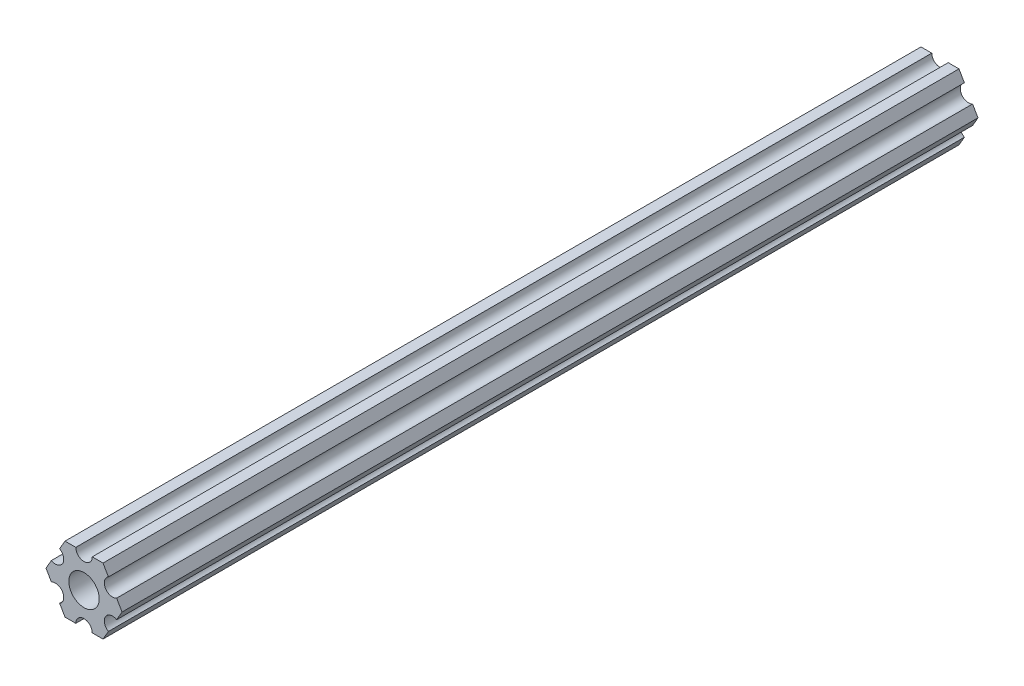
ISO-10303-21;
HEADER;
FILE_DESCRIPTION(('STEP AP214'),'2;1');
FILE_NAME('part.step','',(''),(''),'','','');
FILE_SCHEMA(('AUTOMOTIVE_DESIGN { 1 0 10303 214 1 1 1 1 }'));
ENDSEC;
DATA;
#1=APPLICATION_CONTEXT('core data for automotive mechanical design processes');
#2=APPLICATION_PROTOCOL_DEFINITION('international standard','automotive_design',2000,#1);
#3=PRODUCT_CONTEXT('',#1,'mechanical');
#4=PRODUCT('Part','Part','',(#3));
#5=PRODUCT_RELATED_PRODUCT_CATEGORY('part','',(#4));
#6=PRODUCT_DEFINITION_FORMATION('','',#4);
#7=PRODUCT_DEFINITION_CONTEXT('part definition',#1,'design');
#8=PRODUCT_DEFINITION('design','',#6,#7);
#9=PRODUCT_DEFINITION_SHAPE('','',#8);
#10=(LENGTH_UNIT() NAMED_UNIT(*) SI_UNIT(.MILLI.,.METRE.));
#11=(NAMED_UNIT(*) PLANE_ANGLE_UNIT() SI_UNIT($,.RADIAN.));
#12=(NAMED_UNIT(*) SI_UNIT($,.STERADIAN.) SOLID_ANGLE_UNIT());
#13=UNCERTAINTY_MEASURE_WITH_UNIT(LENGTH_MEASURE(1.E-05),#10,'distance_accuracy_value','');
#14=(GEOMETRIC_REPRESENTATION_CONTEXT(3) GLOBAL_UNCERTAINTY_ASSIGNED_CONTEXT((#13)) GLOBAL_UNIT_ASSIGNED_CONTEXT((#10,
#11,#12)) REPRESENTATION_CONTEXT('',''));
#15=CARTESIAN_POINT('',(0.,0.,0.));
#16=DIRECTION('',(0.,0.,1.));
#17=DIRECTION('',(1.,0.,0.));
#18=AXIS2_PLACEMENT_3D('',#15,#16,#17);
#19=CARTESIAN_POINT('',(5.49926150638083,-3.17499966684068,-165.1));
#20=DIRECTION('',(0.,0.,1.));
#21=DIRECTION('',(1.,0.,0.));
#22=AXIS2_PLACEMENT_3D('',#19,#20,#21);
#23=PLANE('',#22);
#24=CARTESIAN_POINT('',(5.49926150638083,-3.17499966684068,-165.1));
#25=DIRECTION('',(0.,0.,1.));
#26=DIRECTION('',(1.,0.,0.));
#27=AXIS2_PLACEMENT_3D('',#24,#25,#26);
#28=CIRCLE('',#27,1.58750000000001);
#29=CARTESIAN_POINT('',(6.29301142309098,-1.80018429024546,-165.1));
#30=VERTEX_POINT('',#29);
#31=CARTESIAN_POINT('',(4.70551158967068,-4.54981504343589,-165.1));
#32=VERTEX_POINT('',#31);
#33=EDGE_CURVE('E254',#30,#32,#28,.T.);
#34=ORIENTED_EDGE('',*,*,#33,.T.);
#35=DIRECTION('',(-0.499999947533953,-0.866025434075723,0.));
#36=VECTOR('',#35,1.);
#37=CARTESIAN_POINT('',(4.70551158967068,-4.54981504343589,-165.1));
#38=LINE('',#37,#36);
#39=CARTESIAN_POINT('',(3.66617452134693,-6.34999990382519,-165.1));
#40=VERTEX_POINT('',#39);
#41=EDGE_CURVE('E130',#32,#40,#38,.T.);
#42=ORIENTED_EDGE('',*,*,#41,.T.);
#43=DIRECTION('',(-1.,0.,0.));
#44=VECTOR('',#43,1.);
#45=CARTESIAN_POINT('',(3.66617452134693,-6.34999990382519,-165.1));
#46=LINE('',#45,#44);
#47=CARTESIAN_POINT('',(1.58750038469926,-6.34999990382518,-165.1));
#48=VERTEX_POINT('',#47);
#49=EDGE_CURVE('E315',#40,#48,#46,.T.);
#50=ORIENTED_EDGE('',*,*,#49,.T.);
#51=CARTESIAN_POINT('',(3.8469926204343E-07,-6.34999990382519,-165.1));
#52=DIRECTION('',(0.,0.,1.));
#53=DIRECTION('',(1.,0.,0.));
#54=AXIS2_PLACEMENT_3D('',#51,#52,#53);
#55=CIRCLE('',#54,1.5875);
#56=CARTESIAN_POINT('',(-1.58749961530074,-6.34999990382519,-165.1));
#57=VERTEX_POINT('',#56);
#58=EDGE_CURVE('E335',#48,#57,#55,.T.);
#59=ORIENTED_EDGE('',*,*,#58,.T.);
#60=DIRECTION('',(-1.,0.,0.));
#61=VECTOR('',#60,1.);
#62=CARTESIAN_POINT('',(-1.58749961530074,-6.34999990382519,-165.1));
#63=LINE('',#62,#61);
#64=CARTESIAN_POINT('',(-3.66617382465481,-6.34999990382519,-165.1));
#65=VERTEX_POINT('',#64);
#66=EDGE_CURVE('E331',#57,#65,#63,.T.);
#67=ORIENTED_EDGE('',*,*,#66,.T.);
#68=DIRECTION('',(-0.500000006198653,0.866025400205644,0.));
#69=VECTOR('',#68,1.);
#70=CARTESIAN_POINT('',(-3.66617382465481,-6.34999990382519,-165.1));
#71=LINE('',#70,#69);
#72=CARTESIAN_POINT('',(-4.70551094221689,-4.54981523977206,-165.1));
#73=VERTEX_POINT('',#72);
#74=EDGE_CURVE('E334',#65,#73,#71,.T.);
#75=ORIENTED_EDGE('',*,*,#74,.T.);
#76=CARTESIAN_POINT('',(-5.49926095205725,-3.1749999169456,-165.1));
#77=DIRECTION('',(0.,0.,1.));
#78=DIRECTION('',(1.,0.,0.));
#79=AXIS2_PLACEMENT_3D('',#76,#77,#78);
#80=CIRCLE('',#79,1.5875);
#81=CARTESIAN_POINT('',(-6.29301096189761,-1.80018459411914,-165.1));
#82=VERTEX_POINT('',#81);
#83=EDGE_CURVE('E339',#73,#82,#80,.T.);
#84=ORIENTED_EDGE('',*,*,#83,.T.);
#85=DIRECTION('',(-0.500000006198653,0.866025400205645,0.));
#86=VECTOR('',#85,1.);
#87=CARTESIAN_POINT('',(-6.29301096189761,-1.80018459411914,-165.1));
#88=LINE('',#87,#86);
#89=CARTESIAN_POINT('',(-7.33234807945963,6.99338729030344E-08,-165.1));
#90=VERTEX_POINT('',#89);
#91=EDGE_CURVE('E346',#82,#90,#88,.T.);
#92=ORIENTED_EDGE('',*,*,#91,.T.);
#93=DIRECTION('',(0.499999924400249,0.866025447431971,0.));
#94=VECTOR('',#93,1.);
#95=CARTESIAN_POINT('',(-7.33234807945963,6.99338729030344E-08,-165.1));
#96=LINE('',#95,#94);
#97=CARTESIAN_POINT('',(-6.29301121674195,1.80018468525613,-165.1));
#98=VERTEX_POINT('',#97);
#99=EDGE_CURVE('E349',#90,#98,#96,.T.);
#100=ORIENTED_EDGE('',*,*,#99,.T.);
#101=CARTESIAN_POINT('',(-5.49926133675655,3.17500008305439,-165.1));
#102=DIRECTION('',(0.,0.,1.));
#103=DIRECTION('',(1.,0.,0.));
#104=AXIS2_PLACEMENT_3D('',#101,#102,#103);
#105=CIRCLE('',#104,1.5875);
#106=CARTESIAN_POINT('',(-4.70551145677116,4.54981548085265,-165.1));
#107=VERTEX_POINT('',#106);
#108=EDGE_CURVE('E352',#98,#107,#105,.T.);
#109=ORIENTED_EDGE('',*,*,#108,.T.);
#110=DIRECTION('',(0.499999924400249,0.866025447431971,0.));
#111=VECTOR('',#110,1.);
#112=CARTESIAN_POINT('',(-4.70551145677116,4.54981548085265,-165.1));
#113=LINE('',#112,#111);
#114=CARTESIAN_POINT('',(-3.66617452134701,6.35000022210623,-165.1));
#115=VERTEX_POINT('',#114);
#116=EDGE_CURVE('E355',#107,#115,#113,.T.);
#117=ORIENTED_EDGE('',*,*,#116,.T.);
#118=DIRECTION('',(1.,0.,0.));
#119=VECTOR('',#118,1.);
#120=CARTESIAN_POINT('',(-3.66617452134701,6.35000022210623,-165.1));
#121=LINE('',#120,#119);
#122=CARTESIAN_POINT('',(-1.58750038469935,6.35000022210623,-165.1));
#123=VERTEX_POINT('',#122);
#124=EDGE_CURVE('E358',#115,#123,#121,.T.);
#125=ORIENTED_EDGE('',*,*,#124,.T.);
#126=CARTESIAN_POINT('',(-3.84699344941095E-07,6.35000022210623,-165.1));
#127=DIRECTION('',(0.,0.,1.));
#128=DIRECTION('',(1.,0.,0.));
#129=AXIS2_PLACEMENT_3D('',#126,#127,#128);
#130=CIRCLE('',#129,1.5875);
#131=CARTESIAN_POINT('',(1.58749961530066,6.35000022210623,-165.1));
#132=VERTEX_POINT('',#131);
#133=EDGE_CURVE('E361',#123,#132,#130,.T.);
#134=ORIENTED_EDGE('',*,*,#133,.T.);
#135=DIRECTION('',(1.,0.,0.));
#136=VECTOR('',#135,1.);
#137=CARTESIAN_POINT('',(1.58749961530066,6.35000022210623,-165.1));
#138=LINE('',#137,#136);
#139=CARTESIAN_POINT('',(3.66617382465472,6.35000022210622,-165.1));
#140=VERTEX_POINT('',#139);
#141=EDGE_CURVE('E364',#132,#140,#138,.T.);
#142=ORIENTED_EDGE('',*,*,#141,.T.);
#143=DIRECTION('',(0.500000052466056,-0.866025373493145,0.));
#144=VECTOR('',#143,1.);
#145=CARTESIAN_POINT('',(3.66617382465472,6.35000022210622,-165.1));
#146=LINE('',#145,#144);
#147=CARTESIAN_POINT('',(4.70551103839166,4.54981561357968,-165.1));
#148=VERTEX_POINT('',#147);
#149=EDGE_CURVE('E179',#140,#148,#146,.T.);
#150=ORIENTED_EDGE('',*,*,#149,.T.);
#151=CARTESIAN_POINT('',(5.49926112168152,3.17500033315931,-165.1));
#152=DIRECTION('',(0.,0.,1.));
#153=DIRECTION('',(1.,0.,0.));
#154=AXIS2_PLACEMENT_3D('',#151,#152,#153);
#155=CIRCLE('',#154,1.5875);
#156=CARTESIAN_POINT('',(6.29301120497139,1.80018505273895,-165.1));
#157=VERTEX_POINT('',#156);
#158=EDGE_CURVE('E173',#148,#157,#155,.T.);
#159=ORIENTED_EDGE('',*,*,#158,.T.);
#160=DIRECTION('',(0.500000052466056,-0.866025373493145,0.));
#161=VECTOR('',#160,1.);
#162=CARTESIAN_POINT('',(6.29301120497139,1.80018505273895,-165.1));
#163=LINE('',#162,#161);
#164=CARTESIAN_POINT('',(7.33234841870826,4.44212518856872E-07,-165.1));
#165=VERTEX_POINT('',#164);
#166=EDGE_CURVE('E177',#157,#165,#163,.T.);
#167=ORIENTED_EDGE('',*,*,#166,.T.);
#168=DIRECTION('',(-0.499999947533953,-0.866025434075723,0.));
#169=VECTOR('',#168,1.);
#170=CARTESIAN_POINT('',(7.33234841870826,4.44212518856872E-07,-165.1));
#171=LINE('',#170,#169);
#172=EDGE_CURVE('E57',#165,#30,#171,.T.);
#173=ORIENTED_EDGE('',*,*,#172,.T.);
#174=EDGE_LOOP('',(#34,#42,#50,#59,#67,#75,#84,#92,#100,#109,#117,#125,#134,#142,#150,#159,#167,#173));
#175=FACE_BOUND('',#174,.T.);
#176=CARTESIAN_POINT('',(0.,0.,-165.1));
#177=DIRECTION('',(0.,0.,-1.));
#178=DIRECTION('',(1.,0.,0.));
#179=AXIS2_PLACEMENT_3D('',#176,#177,#178);
#180=CIRCLE('',#179,2.9337);
#181=CARTESIAN_POINT('',(2.9337,0.,-165.1));
#182=VERTEX_POINT('',#181);
#183=EDGE_CURVE('E206',#182,#182,#180,.T.);
#184=ORIENTED_EDGE('',*,*,#183,.F.);
#185=EDGE_LOOP('',(#184));
#186=FACE_BOUND('',#185,.T.);
#187=ADVANCED_FACE('F39',(#175,#186),#23,.F.);
#188=CARTESIAN_POINT('',(5.49926150638083,-3.17499966684068,0.));
#189=DIRECTION('',(0.,0.,1.));
#190=DIRECTION('',(1.,0.,0.));
#191=AXIS2_PLACEMENT_3D('',#188,#189,#190);
#192=PLANE('',#191);
#193=CARTESIAN_POINT('',(5.49926150638083,-3.17499966684068,0.));
#194=DIRECTION('',(0.,0.,1.));
#195=DIRECTION('',(1.,0.,0.));
#196=AXIS2_PLACEMENT_3D('',#193,#194,#195);
#197=CIRCLE('',#196,1.58750000000001);
#198=CARTESIAN_POINT('',(6.29301142309098,-1.80018429024546,0.));
#199=VERTEX_POINT('',#198);
#200=CARTESIAN_POINT('',(4.70551158967068,-4.54981504343589,0.));
#201=VERTEX_POINT('',#200);
#202=EDGE_CURVE('E201',#199,#201,#197,.T.);
#203=ORIENTED_EDGE('',*,*,#202,.F.);
#204=DIRECTION('',(-0.499999947533953,-0.866025434075723,0.));
#205=VECTOR('',#204,1.);
#206=CARTESIAN_POINT('',(7.33234841870826,4.44212518856872E-07,0.));
#207=LINE('',#206,#205);
#208=CARTESIAN_POINT('',(7.33234841870826,4.44212518856872E-07,0.));
#209=VERTEX_POINT('',#208);
#210=EDGE_CURVE('E122',#209,#199,#207,.T.);
#211=ORIENTED_EDGE('',*,*,#210,.F.);
#212=DIRECTION('',(0.500000052466056,-0.866025373493145,0.));
#213=VECTOR('',#212,1.);
#214=CARTESIAN_POINT('',(6.29301120497139,1.80018505273895,0.));
#215=LINE('',#214,#213);
#216=CARTESIAN_POINT('',(6.29301120497139,1.80018505273895,0.));
#217=VERTEX_POINT('',#216);
#218=EDGE_CURVE('E116',#217,#209,#215,.T.);
#219=ORIENTED_EDGE('',*,*,#218,.F.);
#220=CARTESIAN_POINT('',(5.49926112168152,3.17500033315931,0.));
#221=DIRECTION('',(0.,0.,1.));
#222=DIRECTION('',(1.,0.,0.));
#223=AXIS2_PLACEMENT_3D('',#220,#221,#222);
#224=CIRCLE('',#223,1.5875);
#225=CARTESIAN_POINT('',(4.70551103839166,4.54981561357968,0.));
#226=VERTEX_POINT('',#225);
#227=EDGE_CURVE('E188',#226,#217,#224,.T.);
#228=ORIENTED_EDGE('',*,*,#227,.F.);
#229=DIRECTION('',(0.500000052466056,-0.866025373493145,0.));
#230=VECTOR('',#229,1.);
#231=CARTESIAN_POINT('',(3.66617382465472,6.35000022210622,0.));
#232=LINE('',#231,#230);
#233=CARTESIAN_POINT('',(3.66617382465472,6.35000022210622,0.));
#234=VERTEX_POINT('',#233);
#235=EDGE_CURVE('E245',#234,#226,#232,.T.);
#236=ORIENTED_EDGE('',*,*,#235,.F.);
#237=DIRECTION('',(1.,0.,0.));
#238=VECTOR('',#237,1.);
#239=CARTESIAN_POINT('',(1.58749961530066,6.35000022210623,0.));
#240=LINE('',#239,#238);
#241=CARTESIAN_POINT('',(1.58749961530066,6.35000022210623,0.));
#242=VERTEX_POINT('',#241);
#243=EDGE_CURVE('E242',#242,#234,#240,.T.);
#244=ORIENTED_EDGE('',*,*,#243,.F.);
#245=CARTESIAN_POINT('',(-3.84699344941095E-07,6.35000022210623,0.));
#246=DIRECTION('',(0.,0.,1.));
#247=DIRECTION('',(1.,0.,0.));
#248=AXIS2_PLACEMENT_3D('',#245,#246,#247);
#249=CIRCLE('',#248,1.5875);
#250=CARTESIAN_POINT('',(-1.58750038469935,6.35000022210623,0.));
#251=VERTEX_POINT('',#250);
#252=EDGE_CURVE('E239',#251,#242,#249,.T.);
#253=ORIENTED_EDGE('',*,*,#252,.F.);
#254=DIRECTION('',(1.,0.,0.));
#255=VECTOR('',#254,1.);
#256=CARTESIAN_POINT('',(-3.66617452134701,6.35000022210623,0.));
#257=LINE('',#256,#255);
#258=CARTESIAN_POINT('',(-3.66617452134701,6.35000022210623,0.));
#259=VERTEX_POINT('',#258);
#260=EDGE_CURVE('E236',#259,#251,#257,.T.);
#261=ORIENTED_EDGE('',*,*,#260,.F.);
#262=DIRECTION('',(0.499999924400249,0.866025447431971,0.));
#263=VECTOR('',#262,1.);
#264=CARTESIAN_POINT('',(-4.70551145677116,4.54981548085265,0.));
#265=LINE('',#264,#263);
#266=CARTESIAN_POINT('',(-4.70551145677116,4.54981548085265,0.));
#267=VERTEX_POINT('',#266);
#268=EDGE_CURVE('E233',#267,#259,#265,.T.);
#269=ORIENTED_EDGE('',*,*,#268,.F.);
#270=CARTESIAN_POINT('',(-5.49926133675655,3.17500008305439,0.));
#271=DIRECTION('',(0.,0.,1.));
#272=DIRECTION('',(1.,0.,0.));
#273=AXIS2_PLACEMENT_3D('',#270,#271,#272);
#274=CIRCLE('',#273,1.5875);
#275=CARTESIAN_POINT('',(-6.29301121674195,1.80018468525613,0.));
#276=VERTEX_POINT('',#275);
#277=EDGE_CURVE('E230',#276,#267,#274,.T.);
#278=ORIENTED_EDGE('',*,*,#277,.F.);
#279=DIRECTION('',(0.499999924400249,0.866025447431971,0.));
#280=VECTOR('',#279,1.);
#281=CARTESIAN_POINT('',(-7.33234807945963,6.99338729030344E-08,0.));
#282=LINE('',#281,#280);
#283=CARTESIAN_POINT('',(-7.33234807945963,6.99338729030344E-08,0.));
#284=VERTEX_POINT('',#283);
#285=EDGE_CURVE('E227',#284,#276,#282,.T.);
#286=ORIENTED_EDGE('',*,*,#285,.F.);
#287=DIRECTION('',(-0.500000006198653,0.866025400205645,0.));
#288=VECTOR('',#287,1.);
#289=CARTESIAN_POINT('',(-6.29301096189761,-1.80018459411914,0.));
#290=LINE('',#289,#288);
#291=CARTESIAN_POINT('',(-6.29301096189761,-1.80018459411914,0.));
#292=VERTEX_POINT('',#291);
#293=EDGE_CURVE('E224',#292,#284,#290,.T.);
#294=ORIENTED_EDGE('',*,*,#293,.F.);
#295=CARTESIAN_POINT('',(-5.49926095205725,-3.1749999169456,0.));
#296=DIRECTION('',(0.,0.,1.));
#297=DIRECTION('',(1.,0.,0.));
#298=AXIS2_PLACEMENT_3D('',#295,#296,#297);
#299=CIRCLE('',#298,1.5875);
#300=CARTESIAN_POINT('',(-4.70551094221689,-4.54981523977206,0.));
#301=VERTEX_POINT('',#300);
#302=EDGE_CURVE('E221',#301,#292,#299,.T.);
#303=ORIENTED_EDGE('',*,*,#302,.F.);
#304=DIRECTION('',(-0.500000006198653,0.866025400205644,0.));
#305=VECTOR('',#304,1.);
#306=CARTESIAN_POINT('',(-3.66617382465481,-6.34999990382519,0.));
#307=LINE('',#306,#305);
#308=CARTESIAN_POINT('',(-3.66617382465481,-6.34999990382519,0.));
#309=VERTEX_POINT('',#308);
#310=EDGE_CURVE('E218',#309,#301,#307,.T.);
#311=ORIENTED_EDGE('',*,*,#310,.F.);
#312=DIRECTION('',(-1.,0.,0.));
#313=VECTOR('',#312,1.);
#314=CARTESIAN_POINT('',(-1.58749961530074,-6.34999990382519,0.));
#315=LINE('',#314,#313);
#316=CARTESIAN_POINT('',(-1.58749961530074,-6.34999990382519,0.));
#317=VERTEX_POINT('',#316);
#318=EDGE_CURVE('E215',#317,#309,#315,.T.);
#319=ORIENTED_EDGE('',*,*,#318,.F.);
#320=CARTESIAN_POINT('',(3.8469926204343E-07,-6.34999990382519,0.));
#321=DIRECTION('',(0.,0.,1.));
#322=DIRECTION('',(1.,0.,0.));
#323=AXIS2_PLACEMENT_3D('',#320,#321,#322);
#324=CIRCLE('',#323,1.5875);
#325=CARTESIAN_POINT('',(1.58750038469926,-6.34999990382518,0.));
#326=VERTEX_POINT('',#325);
#327=EDGE_CURVE('E212',#326,#317,#324,.T.);
#328=ORIENTED_EDGE('',*,*,#327,.F.);
#329=DIRECTION('',(-1.,0.,0.));
#330=VECTOR('',#329,1.);
#331=CARTESIAN_POINT('',(3.66617452134693,-6.34999990382519,0.));
#332=LINE('',#331,#330);
#333=CARTESIAN_POINT('',(3.66617452134693,-6.34999990382519,0.));
#334=VERTEX_POINT('',#333);
#335=EDGE_CURVE('E209',#334,#326,#332,.T.);
#336=ORIENTED_EDGE('',*,*,#335,.F.);
#337=DIRECTION('',(-0.499999947533953,-0.866025434075723,0.));
#338=VECTOR('',#337,1.);
#339=CARTESIAN_POINT('',(4.70551158967068,-4.54981504343589,0.));
#340=LINE('',#339,#338);
#341=EDGE_CURVE('E205',#201,#334,#340,.T.);
#342=ORIENTED_EDGE('',*,*,#341,.F.);
#343=EDGE_LOOP('',(#203,#211,#219,#228,#236,#244,#253,#261,#269,#278,#286,#294,#303,#311,#319,
#328,#336,#342));
#344=FACE_BOUND('',#343,.T.);
#345=CARTESIAN_POINT('',(0.,0.,0.));
#346=DIRECTION('',(0.,0.,-1.));
#347=DIRECTION('',(1.,0.,0.));
#348=AXIS2_PLACEMENT_3D('',#345,#346,#347);
#349=CIRCLE('',#348,2.9337);
#350=CARTESIAN_POINT('',(2.9337,0.,0.));
#351=VERTEX_POINT('',#350);
#352=EDGE_CURVE('E591',#351,#351,#349,.T.);
#353=ORIENTED_EDGE('',*,*,#352,.T.);
#354=EDGE_LOOP('',(#353));
#355=FACE_BOUND('',#354,.T.);
#356=ADVANCED_FACE('F319',(#344,#355),#192,.T.);
#357=CARTESIAN_POINT('',(5.49926150638083,-3.17499966684068,-165.1));
#358=DIRECTION('',(0.,0.,1.));
#359=DIRECTION('',(1.,0.,0.));
#360=AXIS2_PLACEMENT_3D('',#357,#358,#359);
#361=CYLINDRICAL_SURFACE('',#360,1.58750000000001);
#362=ORIENTED_EDGE('',*,*,#202,.T.);
#363=DIRECTION('',(0.,0.,1.));
#364=VECTOR('',#363,1.);
#365=CARTESIAN_POINT('',(4.70551158967068,-4.54981504343589,-165.1));
#366=LINE('',#365,#364);
#367=EDGE_CURVE('E11',#32,#201,#366,.T.);
#368=ORIENTED_EDGE('',*,*,#367,.F.);
#369=ORIENTED_EDGE('',*,*,#33,.F.);
#370=DIRECTION('',(0.,0.,1.));
#371=VECTOR('',#370,1.);
#372=CARTESIAN_POINT('',(6.29301142309098,-1.80018429024546,-165.1));
#373=LINE('',#372,#371);
#374=EDGE_CURVE('E197',#30,#199,#373,.T.);
#375=ORIENTED_EDGE('',*,*,#374,.T.);
#376=EDGE_LOOP('',(#362,#368,#369,#375));
#377=FACE_BOUND('',#376,.T.);
#378=ADVANCED_FACE('F41',(#377),#361,.F.);
#379=CARTESIAN_POINT('',(4.70551158967068,-4.54981504343589,-165.1));
#380=DIRECTION('',(-0.866025434075723,0.499999947533953,0.));
#381=DIRECTION('',(-0.499999947533953,-0.866025434075723,0.));
#382=AXIS2_PLACEMENT_3D('',#379,#380,#381);
#383=PLANE('',#382);
#384=ORIENTED_EDGE('',*,*,#341,.T.);
#385=DIRECTION('',(0.,0.,1.));
#386=VECTOR('',#385,1.);
#387=CARTESIAN_POINT('',(3.66617452134693,-6.34999990382519,-165.1));
#388=LINE('',#387,#386);
#389=EDGE_CURVE('E49',#40,#334,#388,.T.);
#390=ORIENTED_EDGE('',*,*,#389,.F.);
#391=ORIENTED_EDGE('',*,*,#41,.F.);
#392=ORIENTED_EDGE('',*,*,#367,.T.);
#393=EDGE_LOOP('',(#384,#390,#391,#392));
#394=FACE_BOUND('',#393,.T.);
#395=ADVANCED_FACE('F400',(#394),#383,.F.);
#396=CARTESIAN_POINT('',(3.66617452134693,-6.34999990382519,-165.1));
#397=DIRECTION('',(0.,1.,0.));
#398=DIRECTION('',(-1.,0.,0.));
#399=AXIS2_PLACEMENT_3D('',#396,#397,#398);
#400=PLANE('',#399);
#401=ORIENTED_EDGE('',*,*,#335,.T.);
#402=DIRECTION('',(0.,0.,1.));
#403=VECTOR('',#402,1.);
#404=CARTESIAN_POINT('',(1.58750038469926,-6.34999990382518,-165.1));
#405=LINE('',#404,#403);
#406=EDGE_CURVE('E305',#48,#326,#405,.T.);
#407=ORIENTED_EDGE('',*,*,#406,.F.);
#408=ORIENTED_EDGE('',*,*,#49,.F.);
#409=ORIENTED_EDGE('',*,*,#389,.T.);
#410=EDGE_LOOP('',(#401,#407,#408,#409));
#411=FACE_BOUND('',#410,.T.);
#412=ADVANCED_FACE('F313',(#411),#400,.F.);
#413=CARTESIAN_POINT('',(3.8469926204343E-07,-6.34999990382519,-165.1));
#414=DIRECTION('',(0.,0.,1.));
#415=DIRECTION('',(1.,0.,0.));
#416=AXIS2_PLACEMENT_3D('',#413,#414,#415);
#417=CYLINDRICAL_SURFACE('',#416,1.5875);
#418=ORIENTED_EDGE('',*,*,#327,.T.);
#419=DIRECTION('',(0.,0.,1.));
#420=VECTOR('',#419,1.);
#421=CARTESIAN_POINT('',(-1.58749961530074,-6.34999990382519,-165.1));
#422=LINE('',#421,#420);
#423=EDGE_CURVE('E301',#57,#317,#422,.T.);
#424=ORIENTED_EDGE('',*,*,#423,.F.);
#425=ORIENTED_EDGE('',*,*,#58,.F.);
#426=ORIENTED_EDGE('',*,*,#406,.T.);
#427=EDGE_LOOP('',(#418,#424,#425,#426));
#428=FACE_BOUND('',#427,.T.);
#429=ADVANCED_FACE('F325',(#428),#417,.F.);
#430=CARTESIAN_POINT('',(-1.58749961530074,-6.34999990382519,-165.1));
#431=DIRECTION('',(0.,1.,0.));
#432=DIRECTION('',(-1.,0.,0.));
#433=AXIS2_PLACEMENT_3D('',#430,#431,#432);
#434=PLANE('',#433);
#435=ORIENTED_EDGE('',*,*,#318,.T.);
#436=DIRECTION('',(0.,0.,1.));
#437=VECTOR('',#436,1.);
#438=CARTESIAN_POINT('',(-3.66617382465481,-6.34999990382519,-165.1));
#439=LINE('',#438,#437);
#440=EDGE_CURVE('E297',#65,#309,#439,.T.);
#441=ORIENTED_EDGE('',*,*,#440,.F.);
#442=ORIENTED_EDGE('',*,*,#66,.F.);
#443=ORIENTED_EDGE('',*,*,#423,.T.);
#444=EDGE_LOOP('',(#435,#441,#442,#443));
#445=FACE_BOUND('',#444,.T.);
#446=ADVANCED_FACE('F329',(#445),#434,.F.);
#447=CARTESIAN_POINT('',(-3.66617382465481,-6.34999990382519,-165.1));
#448=DIRECTION('',(0.866025400205645,0.500000006198653,0.));
#449=DIRECTION('',(-0.500000006198653,0.866025400205645,0.));
#450=AXIS2_PLACEMENT_3D('',#447,#448,#449);
#451=PLANE('',#450);
#452=ORIENTED_EDGE('',*,*,#310,.T.);
#453=DIRECTION('',(0.,0.,1.));
#454=VECTOR('',#453,1.);
#455=CARTESIAN_POINT('',(-4.70551094221689,-4.54981523977206,-165.1));
#456=LINE('',#455,#454);
#457=EDGE_CURVE('E293',#73,#301,#456,.T.);
#458=ORIENTED_EDGE('',*,*,#457,.F.);
#459=ORIENTED_EDGE('',*,*,#74,.F.);
#460=ORIENTED_EDGE('',*,*,#440,.T.);
#461=EDGE_LOOP('',(#452,#458,#459,#460));
#462=FACE_BOUND('',#461,.T.);
#463=ADVANCED_FACE('F413',(#462),#451,.F.);
#464=CARTESIAN_POINT('',(-5.49926095205725,-3.1749999169456,-165.1));
#465=DIRECTION('',(0.,0.,1.));
#466=DIRECTION('',(1.,0.,0.));
#467=AXIS2_PLACEMENT_3D('',#464,#465,#466);
#468=CYLINDRICAL_SURFACE('',#467,1.5875);
#469=ORIENTED_EDGE('',*,*,#302,.T.);
#470=DIRECTION('',(0.,0.,1.));
#471=VECTOR('',#470,1.);
#472=CARTESIAN_POINT('',(-6.29301096189761,-1.80018459411914,-165.1));
#473=LINE('',#472,#471);
#474=EDGE_CURVE('E289',#82,#292,#473,.T.);
#475=ORIENTED_EDGE('',*,*,#474,.F.);
#476=ORIENTED_EDGE('',*,*,#83,.F.);
#477=ORIENTED_EDGE('',*,*,#457,.T.);
#478=EDGE_LOOP('',(#469,#475,#476,#477));
#479=FACE_BOUND('',#478,.T.);
#480=ADVANCED_FACE('F416',(#479),#468,.F.);
#481=CARTESIAN_POINT('',(-6.29301096189761,-1.80018459411914,-165.1));
#482=DIRECTION('',(0.866025400205645,0.500000006198653,0.));
#483=DIRECTION('',(-0.500000006198653,0.866025400205645,0.));
#484=AXIS2_PLACEMENT_3D('',#481,#482,#483);
#485=PLANE('',#484);
#486=ORIENTED_EDGE('',*,*,#293,.T.);
#487=DIRECTION('',(0.,0.,1.));
#488=VECTOR('',#487,1.);
#489=CARTESIAN_POINT('',(-7.33234807945963,6.99338729030344E-08,-165.1));
#490=LINE('',#489,#488);
#491=EDGE_CURVE('E285',#90,#284,#490,.T.);
#492=ORIENTED_EDGE('',*,*,#491,.F.);
#493=ORIENTED_EDGE('',*,*,#91,.F.);
#494=ORIENTED_EDGE('',*,*,#474,.T.);
#495=EDGE_LOOP('',(#486,#492,#493,#494));
#496=FACE_BOUND('',#495,.T.);
#497=ADVANCED_FACE('F420',(#496),#485,.F.);
#498=CARTESIAN_POINT('',(-7.33234807945963,6.99338729030344E-08,-165.1));
#499=DIRECTION('',(0.866025447431971,-0.499999924400249,0.));
#500=DIRECTION('',(0.499999924400249,0.866025447431971,0.));
#501=AXIS2_PLACEMENT_3D('',#498,#499,#500);
#502=PLANE('',#501);
#503=ORIENTED_EDGE('',*,*,#285,.T.);
#504=DIRECTION('',(0.,0.,1.));
#505=VECTOR('',#504,1.);
#506=CARTESIAN_POINT('',(-6.29301121674195,1.80018468525613,-165.1));
#507=LINE('',#506,#505);
#508=EDGE_CURVE('E281',#98,#276,#507,.T.);
#509=ORIENTED_EDGE('',*,*,#508,.F.);
#510=ORIENTED_EDGE('',*,*,#99,.F.);
#511=ORIENTED_EDGE('',*,*,#491,.T.);
#512=EDGE_LOOP('',(#503,#509,#510,#511));
#513=FACE_BOUND('',#512,.T.);
#514=ADVANCED_FACE('F424',(#513),#502,.F.);
#515=CARTESIAN_POINT('',(-5.49926133675655,3.17500008305439,-165.1));
#516=DIRECTION('',(0.,0.,1.));
#517=DIRECTION('',(1.,0.,0.));
#518=AXIS2_PLACEMENT_3D('',#515,#516,#517);
#519=CYLINDRICAL_SURFACE('',#518,1.5875);
#520=ORIENTED_EDGE('',*,*,#277,.T.);
#521=DIRECTION('',(0.,0.,1.));
#522=VECTOR('',#521,1.);
#523=CARTESIAN_POINT('',(-4.70551145677116,4.54981548085265,-165.1));
#524=LINE('',#523,#522);
#525=EDGE_CURVE('E277',#107,#267,#524,.T.);
#526=ORIENTED_EDGE('',*,*,#525,.F.);
#527=ORIENTED_EDGE('',*,*,#108,.F.);
#528=ORIENTED_EDGE('',*,*,#508,.T.);
#529=EDGE_LOOP('',(#520,#526,#527,#528));
#530=FACE_BOUND('',#529,.T.);
#531=ADVANCED_FACE('F428',(#530),#519,.F.);
#532=CARTESIAN_POINT('',(-4.70551145677116,4.54981548085265,-165.1));
#533=DIRECTION('',(0.866025447431971,-0.499999924400249,0.));
#534=DIRECTION('',(0.499999924400249,0.866025447431971,0.));
#535=AXIS2_PLACEMENT_3D('',#532,#533,#534);
#536=PLANE('',#535);
#537=ORIENTED_EDGE('',*,*,#268,.T.);
#538=DIRECTION('',(0.,0.,1.));
#539=VECTOR('',#538,1.);
#540=CARTESIAN_POINT('',(-3.66617452134701,6.35000022210623,-165.1));
#541=LINE('',#540,#539);
#542=EDGE_CURVE('E273',#115,#259,#541,.T.);
#543=ORIENTED_EDGE('',*,*,#542,.F.);
#544=ORIENTED_EDGE('',*,*,#116,.F.);
#545=ORIENTED_EDGE('',*,*,#525,.T.);
#546=EDGE_LOOP('',(#537,#543,#544,#545));
#547=FACE_BOUND('',#546,.T.);
#548=ADVANCED_FACE('F432',(#547),#536,.F.);
#549=CARTESIAN_POINT('',(-3.66617452134701,6.35000022210623,-165.1));
#550=DIRECTION('',(0.,-1.,0.));
#551=DIRECTION('',(0.,0.,-1.));
#552=AXIS2_PLACEMENT_3D('',#549,#550,#551);
#553=PLANE('',#552);
#554=ORIENTED_EDGE('',*,*,#260,.T.);
#555=DIRECTION('',(0.,0.,1.));
#556=VECTOR('',#555,1.);
#557=CARTESIAN_POINT('',(-1.58750038469935,6.35000022210623,-165.1));
#558=LINE('',#557,#556);
#559=EDGE_CURVE('E269',#123,#251,#558,.T.);
#560=ORIENTED_EDGE('',*,*,#559,.F.);
#561=ORIENTED_EDGE('',*,*,#124,.F.);
#562=ORIENTED_EDGE('',*,*,#542,.T.);
#563=EDGE_LOOP('',(#554,#560,#561,#562));
#564=FACE_BOUND('',#563,.T.);
#565=ADVANCED_FACE('F436',(#564),#553,.F.);
#566=CARTESIAN_POINT('',(-3.84699344941095E-07,6.35000022210623,-165.1));
#567=DIRECTION('',(0.,0.,1.));
#568=DIRECTION('',(1.,0.,0.));
#569=AXIS2_PLACEMENT_3D('',#566,#567,#568);
#570=CYLINDRICAL_SURFACE('',#569,1.5875);
#571=ORIENTED_EDGE('',*,*,#252,.T.);
#572=DIRECTION('',(0.,0.,1.));
#573=VECTOR('',#572,1.);
#574=CARTESIAN_POINT('',(1.58749961530066,6.35000022210623,-165.1));
#575=LINE('',#574,#573);
#576=EDGE_CURVE('E265',#132,#242,#575,.T.);
#577=ORIENTED_EDGE('',*,*,#576,.F.);
#578=ORIENTED_EDGE('',*,*,#133,.F.);
#579=ORIENTED_EDGE('',*,*,#559,.T.);
#580=EDGE_LOOP('',(#571,#577,#578,#579));
#581=FACE_BOUND('',#580,.T.);
#582=ADVANCED_FACE('F440',(#581),#570,.F.);
#583=CARTESIAN_POINT('',(1.58749961530066,6.35000022210623,-165.1));
#584=DIRECTION('',(0.,-1.,0.));
#585=DIRECTION('',(1.,0.,0.));
#586=AXIS2_PLACEMENT_3D('',#583,#584,#585);
#587=PLANE('',#586);
#588=ORIENTED_EDGE('',*,*,#243,.T.);
#589=DIRECTION('',(0.,0.,1.));
#590=VECTOR('',#589,1.);
#591=CARTESIAN_POINT('',(3.66617382465472,6.35000022210622,-165.1));
#592=LINE('',#591,#590);
#593=EDGE_CURVE('E261',#140,#234,#592,.T.);
#594=ORIENTED_EDGE('',*,*,#593,.F.);
#595=ORIENTED_EDGE('',*,*,#141,.F.);
#596=ORIENTED_EDGE('',*,*,#576,.T.);
#597=EDGE_LOOP('',(#588,#594,#595,#596));
#598=FACE_BOUND('',#597,.T.);
#599=ADVANCED_FACE('F372',(#598),#587,.F.);
#600=CARTESIAN_POINT('',(3.66617382465472,6.35000022210622,-165.1));
#601=DIRECTION('',(-0.866025373493145,-0.500000052466056,0.));
#602=DIRECTION('',(0.500000052466056,-0.866025373493145,0.));
#603=AXIS2_PLACEMENT_3D('',#600,#601,#602);
#604=PLANE('',#603);
#605=ORIENTED_EDGE('',*,*,#235,.T.);
#606=DIRECTION('',(0.,0.,1.));
#607=VECTOR('',#606,1.);
#608=CARTESIAN_POINT('',(4.70551103839166,4.54981561357968,-165.1));
#609=LINE('',#608,#607);
#610=EDGE_CURVE('E190',#148,#226,#609,.T.);
#611=ORIENTED_EDGE('',*,*,#610,.F.);
#612=ORIENTED_EDGE('',*,*,#149,.F.);
#613=ORIENTED_EDGE('',*,*,#593,.T.);
#614=EDGE_LOOP('',(#605,#611,#612,#613));
#615=FACE_BOUND('',#614,.T.);
#616=ADVANCED_FACE('F376',(#615),#604,.F.);
#617=CARTESIAN_POINT('',(5.49926112168152,3.17500033315931,-165.1));
#618=DIRECTION('',(0.,0.,1.));
#619=DIRECTION('',(1.,0.,0.));
#620=AXIS2_PLACEMENT_3D('',#617,#618,#619);
#621=CYLINDRICAL_SURFACE('',#620,1.5875);
#622=ORIENTED_EDGE('',*,*,#227,.T.);
#623=DIRECTION('',(0.,0.,1.));
#624=VECTOR('',#623,1.);
#625=CARTESIAN_POINT('',(6.29301120497139,1.80018505273895,-165.1));
#626=LINE('',#625,#624);
#627=EDGE_CURVE('E185',#157,#217,#626,.T.);
#628=ORIENTED_EDGE('',*,*,#627,.F.);
#629=ORIENTED_EDGE('',*,*,#158,.F.);
#630=ORIENTED_EDGE('',*,*,#610,.T.);
#631=EDGE_LOOP('',(#622,#628,#629,#630));
#632=FACE_BOUND('',#631,.T.);
#633=ADVANCED_FACE('F186',(#632),#621,.F.);
#634=CARTESIAN_POINT('',(6.29301120497139,1.80018505273895,-165.1));
#635=DIRECTION('',(-0.866025373493145,-0.500000052466056,0.));
#636=DIRECTION('',(0.500000052466056,-0.866025373493145,0.));
#637=AXIS2_PLACEMENT_3D('',#634,#635,#636);
#638=PLANE('',#637);
#639=ORIENTED_EDGE('',*,*,#218,.T.);
#640=DIRECTION('',(0.,0.,1.));
#641=VECTOR('',#640,1.);
#642=CARTESIAN_POINT('',(7.33234841870826,4.44212518856872E-07,-165.1));
#643=LINE('',#642,#641);
#644=EDGE_CURVE('E191',#165,#209,#643,.T.);
#645=ORIENTED_EDGE('',*,*,#644,.F.);
#646=ORIENTED_EDGE('',*,*,#166,.F.);
#647=ORIENTED_EDGE('',*,*,#627,.T.);
#648=EDGE_LOOP('',(#639,#645,#646,#647));
#649=FACE_BOUND('',#648,.T.);
#650=ADVANCED_FACE('F193',(#649),#638,.F.);
#651=CARTESIAN_POINT('',(7.33234841870826,4.44212518856872E-07,-165.1));
#652=DIRECTION('',(-0.866025434075723,0.499999947533953,0.));
#653=DIRECTION('',(-0.499999947533953,-0.866025434075723,0.));
#654=AXIS2_PLACEMENT_3D('',#651,#652,#653);
#655=PLANE('',#654);
#656=ORIENTED_EDGE('',*,*,#210,.T.);
#657=ORIENTED_EDGE('',*,*,#374,.F.);
#658=ORIENTED_EDGE('',*,*,#172,.F.);
#659=ORIENTED_EDGE('',*,*,#644,.T.);
#660=EDGE_LOOP('',(#656,#657,#658,#659));
#661=FACE_BOUND('',#660,.T.);
#662=ADVANCED_FACE('F380',(#661),#655,.F.);
#663=CARTESIAN_POINT('',(0.,0.,-165.1));
#664=DIRECTION('',(0.,0.,1.));
#665=DIRECTION('',(1.,0.,0.));
#666=AXIS2_PLACEMENT_3D('',#663,#664,#665);
#667=CYLINDRICAL_SURFACE('',#666,2.9337);
#668=ORIENTED_EDGE('',*,*,#183,.T.);
#669=EDGE_LOOP('',(#668));
#670=FACE_BOUND('',#669,.T.);
#671=ORIENTED_EDGE('',*,*,#352,.F.);
#672=EDGE_LOOP('',(#671));
#673=FACE_BOUND('',#672,.T.);
#674=ADVANCED_FACE('F382',(#670,#673),#667,.F.);
#675=CLOSED_SHELL('',(#187,#356,#378,#395,#412,#429,#446,#463,#480,#497,#514,#531,#548,#565,
#582,#599,#616,#633,#650,#662,#674));
#676=MANIFOLD_SOLID_BREP('B2',#675);
#677=ADVANCED_BREP_SHAPE_REPRESENTATION('',(#18,#676),#14);
#678=SHAPE_DEFINITION_REPRESENTATION(#9,#677);
ENDSEC;
END-ISO-10303-21;
